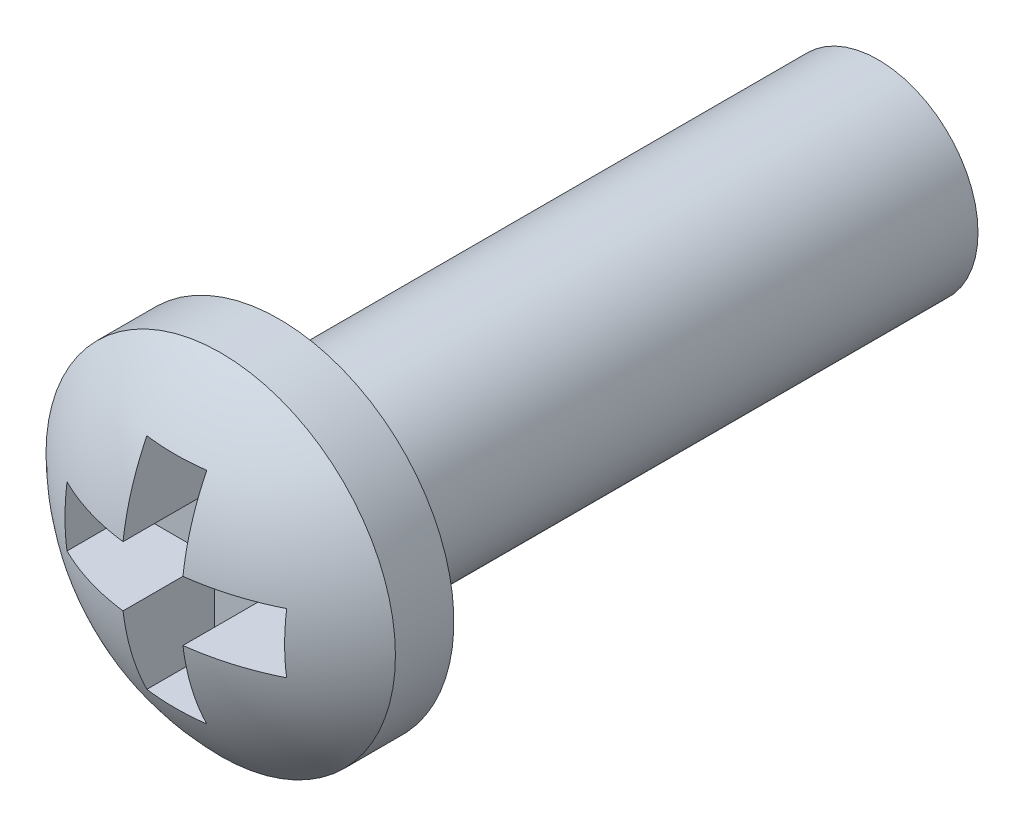
ISO-10303-21;
HEADER;
FILE_DESCRIPTION(('STEP AP214'),'2;1');
FILE_NAME('part.step','',(''),(''),'','','');
FILE_SCHEMA(('AUTOMOTIVE_DESIGN { 1 0 10303 214 1 1 1 1 }'));
ENDSEC;
DATA;
#1=APPLICATION_CONTEXT('core data for automotive mechanical design processes');
#2=APPLICATION_PROTOCOL_DEFINITION('international standard','automotive_design',2000,#1);
#3=PRODUCT_CONTEXT('',#1,'mechanical');
#4=PRODUCT('Part','Part','',(#3));
#5=PRODUCT_RELATED_PRODUCT_CATEGORY('part','',(#4));
#6=PRODUCT_DEFINITION_FORMATION('','',#4);
#7=PRODUCT_DEFINITION_CONTEXT('part definition',#1,'design');
#8=PRODUCT_DEFINITION('design','',#6,#7);
#9=PRODUCT_DEFINITION_SHAPE('','',#8);
#10=(LENGTH_UNIT() NAMED_UNIT(*) SI_UNIT(.MILLI.,.METRE.));
#11=(NAMED_UNIT(*) PLANE_ANGLE_UNIT() SI_UNIT($,.RADIAN.));
#12=(NAMED_UNIT(*) SI_UNIT($,.STERADIAN.) SOLID_ANGLE_UNIT());
#13=UNCERTAINTY_MEASURE_WITH_UNIT(LENGTH_MEASURE(1.E-05),#10,'distance_accuracy_value','');
#14=(GEOMETRIC_REPRESENTATION_CONTEXT(3) GLOBAL_UNCERTAINTY_ASSIGNED_CONTEXT((#13)) GLOBAL_UNIT_ASSIGNED_CONTEXT((#10,
#11,#12)) REPRESENTATION_CONTEXT('',''));
#15=CARTESIAN_POINT('',(0.,0.,0.));
#16=DIRECTION('',(0.,0.,1.));
#17=DIRECTION('',(1.,0.,0.));
#18=AXIS2_PLACEMENT_3D('',#15,#16,#17);
#19=CARTESIAN_POINT('',(0.,0.,-6.));
#20=DIRECTION('',(0.,0.,1.));
#21=DIRECTION('',(1.,0.,0.));
#22=AXIS2_PLACEMENT_3D('',#19,#20,#21);
#23=CYLINDRICAL_SURFACE('',#22,1.);
#24=CARTESIAN_POINT('',(0.,0.,-6.));
#25=DIRECTION('',(0.,0.,1.));
#26=DIRECTION('',(1.,0.,0.));
#27=AXIS2_PLACEMENT_3D('',#24,#25,#26);
#28=CIRCLE('',#27,1.);
#29=CARTESIAN_POINT('',(1.,0.,-6.));
#30=VERTEX_POINT('',#29);
#31=EDGE_CURVE('E212',#30,#30,#28,.T.);
#32=ORIENTED_EDGE('',*,*,#31,.T.);
#33=EDGE_LOOP('',(#32));
#34=FACE_BOUND('',#33,.T.);
#35=CARTESIAN_POINT('',(0.,0.,0.));
#36=DIRECTION('',(0.,0.,1.));
#37=DIRECTION('',(1.,0.,0.));
#38=AXIS2_PLACEMENT_3D('',#35,#36,#37);
#39=CIRCLE('',#38,1.);
#40=CARTESIAN_POINT('',(1.,0.,0.));
#41=VERTEX_POINT('',#40);
#42=EDGE_CURVE('E208',#41,#41,#39,.T.);
#43=ORIENTED_EDGE('',*,*,#42,.F.);
#44=EDGE_LOOP('',(#43));
#45=FACE_BOUND('',#44,.T.);
#46=ADVANCED_FACE('F41',(#34,#45),#23,.T.);
#47=CARTESIAN_POINT('',(0.,0.,-6.));
#48=DIRECTION('',(0.,0.,1.));
#49=DIRECTION('',(1.,0.,0.));
#50=AXIS2_PLACEMENT_3D('',#47,#48,#49);
#51=PLANE('',#50);
#52=ORIENTED_EDGE('',*,*,#31,.F.);
#53=EDGE_LOOP('',(#52));
#54=FACE_BOUND('',#53,.T.);
#55=ADVANCED_FACE('F281',(#54),#51,.F.);
#56=CARTESIAN_POINT('',(0.,0.,0.));
#57=DIRECTION('',(0.,0.,1.));
#58=DIRECTION('',(1.,0.,0.));
#59=AXIS2_PLACEMENT_3D('',#56,#57,#58);
#60=PLANE('',#59);
#61=ORIENTED_EDGE('',*,*,#42,.T.);
#62=EDGE_LOOP('',(#61));
#63=FACE_BOUND('',#62,.T.);
#64=CARTESIAN_POINT('',(0.,0.,0.));
#65=DIRECTION('',(0.,0.,-1.));
#66=DIRECTION('',(-1.,0.,0.));
#67=AXIS2_PLACEMENT_3D('',#64,#65,#66);
#68=CIRCLE('',#67,1.75);
#69=CARTESIAN_POINT('',(-1.75,0.,0.));
#70=VERTEX_POINT('',#69);
#71=EDGE_CURVE('E210',#70,#70,#68,.T.);
#72=ORIENTED_EDGE('',*,*,#71,.T.);
#73=EDGE_LOOP('',(#72));
#74=FACE_BOUND('',#73,.T.);
#75=ADVANCED_FACE('F286',(#63,#74),#60,.F.);
#76=CARTESIAN_POINT('',(0.,0.,-2.));
#77=DIRECTION('',(0.,0.,-1.));
#78=DIRECTION('',(-1.,0.,0.));
#79=AXIS2_PLACEMENT_3D('',#76,#77,#78);
#80=CYLINDRICAL_SURFACE('',#79,1.75);
#81=ORIENTED_EDGE('',*,*,#71,.F.);
#82=EDGE_LOOP('',(#81));
#83=FACE_BOUND('',#82,.T.);
#84=CARTESIAN_POINT('',(0.,0.,0.585357107135713));
#85=DIRECTION('',(0.,0.,-1.));
#86=DIRECTION('',(-1.,0.,0.));
#87=AXIS2_PLACEMENT_3D('',#84,#85,#86);
#88=CIRCLE('',#87,1.75);
#89=CARTESIAN_POINT('',(-1.75,0.,0.585357107135713));
#90=VERTEX_POINT('',#89);
#91=EDGE_CURVE('E179',#90,#90,#88,.T.);
#92=ORIENTED_EDGE('',*,*,#91,.T.);
#93=EDGE_LOOP('',(#92));
#94=FACE_BOUND('',#93,.T.);
#95=ADVANCED_FACE('F300',(#83,#94),#80,.T.);
#96=CARTESIAN_POINT('',(0.,0.,-1.2));
#97=DIRECTION('',(0.,0.,-1.));
#98=DIRECTION('',(1.,0.,0.));
#99=AXIS2_PLACEMENT_3D('',#96,#97,#98);
#100=SPHERICAL_SURFACE('',#99,2.5);
#101=CARTESIAN_POINT('',(0.,-1.1,-1.2));
#102=DIRECTION('',(0.,-1.,0.));
#103=DIRECTION('',(0.,0.,-1.));
#104=AXIS2_PLACEMENT_3D('',#101,#102,#103);
#105=CIRCLE('',#104,2.24499443206437);
#106=CARTESIAN_POINT('',(0.3,-1.1,1.0248595461287));
#107=VERTEX_POINT('',#106);
#108=CARTESIAN_POINT('',(-0.3,-1.1,1.0248595461287));
#109=VERTEX_POINT('',#108);
#110=EDGE_CURVE('E211',#107,#109,#105,.T.);
#111=ORIENTED_EDGE('',*,*,#110,.T.);
#112=CARTESIAN_POINT('',(-0.3,0.,-1.2));
#113=DIRECTION('',(-1.,0.,0.));
#114=DIRECTION('',(0.,0.,1.));
#115=AXIS2_PLACEMENT_3D('',#112,#113,#114);
#116=CIRCLE('',#115,2.48193472919818);
#117=CARTESIAN_POINT('',(-0.3,-0.3,1.26373699895098));
#118=VERTEX_POINT('',#117);
#119=EDGE_CURVE('E11',#109,#118,#116,.T.);
#120=ORIENTED_EDGE('',*,*,#119,.T.);
#121=CARTESIAN_POINT('',(0.,-0.3,-1.2));
#122=DIRECTION('',(0.,-1.,0.));
#123=DIRECTION('',(0.,0.,-1.));
#124=AXIS2_PLACEMENT_3D('',#121,#122,#123);
#125=CIRCLE('',#124,2.48193472919818);
#126=CARTESIAN_POINT('',(-1.1,-0.3,1.0248595461287));
#127=VERTEX_POINT('',#126);
#128=EDGE_CURVE('E48',#118,#127,#125,.T.);
#129=ORIENTED_EDGE('',*,*,#128,.T.);
#130=CARTESIAN_POINT('',(-1.1,0.,-1.2));
#131=DIRECTION('',(-1.,0.,0.));
#132=DIRECTION('',(0.,0.,1.));
#133=AXIS2_PLACEMENT_3D('',#130,#131,#132);
#134=CIRCLE('',#133,2.24499443206437);
#135=CARTESIAN_POINT('',(-1.1,0.3,1.0248595461287));
#136=VERTEX_POINT('',#135);
#137=EDGE_CURVE('E241',#127,#136,#134,.T.);
#138=ORIENTED_EDGE('',*,*,#137,.T.);
#139=CARTESIAN_POINT('',(0.,0.3,-1.2));
#140=DIRECTION('',(0.,1.,0.));
#141=DIRECTION('',(0.,0.,1.));
#142=AXIS2_PLACEMENT_3D('',#139,#140,#141);
#143=CIRCLE('',#142,2.48193472919818);
#144=CARTESIAN_POINT('',(-0.3,0.3,1.26373699895098));
#145=VERTEX_POINT('',#144);
#146=EDGE_CURVE('E236',#136,#145,#143,.T.);
#147=ORIENTED_EDGE('',*,*,#146,.T.);
#148=CARTESIAN_POINT('',(-0.3,0.,-1.2));
#149=DIRECTION('',(-1.,0.,0.));
#150=DIRECTION('',(0.,0.,1.));
#151=AXIS2_PLACEMENT_3D('',#148,#149,#150);
#152=CIRCLE('',#151,2.48193472919818);
#153=CARTESIAN_POINT('',(-0.3,1.1,1.0248595461287));
#154=VERTEX_POINT('',#153);
#155=EDGE_CURVE('E237',#145,#154,#152,.T.);
#156=ORIENTED_EDGE('',*,*,#155,.T.);
#157=CARTESIAN_POINT('',(0.,1.1,-1.2));
#158=DIRECTION('',(0.,1.,0.));
#159=DIRECTION('',(0.,0.,1.));
#160=AXIS2_PLACEMENT_3D('',#157,#158,#159);
#161=CIRCLE('',#160,2.24499443206437);
#162=CARTESIAN_POINT('',(0.3,1.1,1.0248595461287));
#163=VERTEX_POINT('',#162);
#164=EDGE_CURVE('E231',#154,#163,#161,.T.);
#165=ORIENTED_EDGE('',*,*,#164,.T.);
#166=CARTESIAN_POINT('',(0.3,0.,-1.2));
#167=DIRECTION('',(1.,0.,0.));
#168=DIRECTION('',(0.,0.,-1.));
#169=AXIS2_PLACEMENT_3D('',#166,#167,#168);
#170=CIRCLE('',#169,2.48193472919818);
#171=CARTESIAN_POINT('',(0.3,0.3,1.26373699895098));
#172=VERTEX_POINT('',#171);
#173=EDGE_CURVE('E228',#163,#172,#170,.T.);
#174=ORIENTED_EDGE('',*,*,#173,.T.);
#175=CARTESIAN_POINT('',(0.,0.3,-1.2));
#176=DIRECTION('',(0.,1.,0.));
#177=DIRECTION('',(0.,0.,1.));
#178=AXIS2_PLACEMENT_3D('',#175,#176,#177);
#179=CIRCLE('',#178,2.48193472919818);
#180=CARTESIAN_POINT('',(1.1,0.3,1.0248595461287));
#181=VERTEX_POINT('',#180);
#182=EDGE_CURVE('E229',#172,#181,#179,.T.);
#183=ORIENTED_EDGE('',*,*,#182,.T.);
#184=CARTESIAN_POINT('',(1.1,0.,-1.2));
#185=DIRECTION('',(1.,0.,0.));
#186=DIRECTION('',(0.,0.,-1.));
#187=AXIS2_PLACEMENT_3D('',#184,#185,#186);
#188=CIRCLE('',#187,2.24499443206437);
#189=CARTESIAN_POINT('',(1.1,-0.3,1.0248595461287));
#190=VERTEX_POINT('',#189);
#191=EDGE_CURVE('E224',#181,#190,#188,.T.);
#192=ORIENTED_EDGE('',*,*,#191,.T.);
#193=CARTESIAN_POINT('',(0.,-0.3,-1.2));
#194=DIRECTION('',(0.,-1.,0.));
#195=DIRECTION('',(0.,0.,-1.));
#196=AXIS2_PLACEMENT_3D('',#193,#194,#195);
#197=CIRCLE('',#196,2.48193472919818);
#198=CARTESIAN_POINT('',(0.3,-0.3,1.26373699895098));
#199=VERTEX_POINT('',#198);
#200=EDGE_CURVE('E222',#190,#199,#197,.T.);
#201=ORIENTED_EDGE('',*,*,#200,.T.);
#202=CARTESIAN_POINT('',(0.3,0.,-1.2));
#203=DIRECTION('',(1.,0.,0.));
#204=DIRECTION('',(0.,0.,-1.));
#205=AXIS2_PLACEMENT_3D('',#202,#203,#204);
#206=CIRCLE('',#205,2.48193472919818);
#207=EDGE_CURVE('E220',#199,#107,#206,.T.);
#208=ORIENTED_EDGE('',*,*,#207,.T.);
#209=EDGE_LOOP('',(#111,#120,#129,#138,#147,#156,#165,#174,#183,#192,#201,#208));
#210=FACE_BOUND('',#209,.T.);
#211=ORIENTED_EDGE('',*,*,#91,.F.);
#212=EDGE_LOOP('',(#211));
#213=FACE_BOUND('',#212,.T.);
#214=ADVANCED_FACE('F242',(#210,#213),#100,.T.);
#215=CARTESIAN_POINT('',(-0.3,-0.3,0.35));
#216=DIRECTION('',(-1.,0.,0.));
#217=DIRECTION('',(0.,0.,1.));
#218=AXIS2_PLACEMENT_3D('',#215,#216,#217);
#219=PLANE('',#218);
#220=DIRECTION('',(0.,0.,1.));
#221=VECTOR('',#220,1.);
#222=CARTESIAN_POINT('',(-0.3,-1.1,0.35));
#223=LINE('',#222,#221);
#224=CARTESIAN_POINT('',(-0.3,-1.1,0.35));
#225=VERTEX_POINT('',#224);
#226=EDGE_CURVE('E54',#225,#109,#223,.T.);
#227=ORIENTED_EDGE('',*,*,#226,.F.);
#228=DIRECTION('',(0.,-1.,0.));
#229=VECTOR('',#228,1.);
#230=CARTESIAN_POINT('',(-0.3,-0.3,0.35));
#231=LINE('',#230,#229);
#232=CARTESIAN_POINT('',(-0.3,-0.3,0.35));
#233=VERTEX_POINT('',#232);
#234=EDGE_CURVE('E129',#233,#225,#231,.T.);
#235=ORIENTED_EDGE('',*,*,#234,.F.);
#236=DIRECTION('',(0.,0.,1.));
#237=VECTOR('',#236,1.);
#238=CARTESIAN_POINT('',(-0.3,-0.3,0.35));
#239=LINE('',#238,#237);
#240=EDGE_CURVE('E171',#233,#118,#239,.T.);
#241=ORIENTED_EDGE('',*,*,#240,.T.);
#242=ORIENTED_EDGE('',*,*,#119,.F.);
#243=EDGE_LOOP('',(#227,#235,#241,#242));
#244=FACE_BOUND('',#243,.T.);
#245=ADVANCED_FACE('F127',(#244),#219,.F.);
#246=CARTESIAN_POINT('',(-1.1,-0.3,0.35));
#247=DIRECTION('',(0.,-1.,0.));
#248=DIRECTION('',(0.,0.,-1.));
#249=AXIS2_PLACEMENT_3D('',#246,#247,#248);
#250=PLANE('',#249);
#251=ORIENTED_EDGE('',*,*,#240,.F.);
#252=DIRECTION('',(1.,0.,0.));
#253=VECTOR('',#252,1.);
#254=CARTESIAN_POINT('',(-1.1,-0.3,0.35));
#255=LINE('',#254,#253);
#256=CARTESIAN_POINT('',(-1.1,-0.3,0.35));
#257=VERTEX_POINT('',#256);
#258=EDGE_CURVE('E131',#257,#233,#255,.T.);
#259=ORIENTED_EDGE('',*,*,#258,.F.);
#260=DIRECTION('',(0.,0.,1.));
#261=VECTOR('',#260,1.);
#262=CARTESIAN_POINT('',(-1.1,-0.3,0.35));
#263=LINE('',#262,#261);
#264=EDGE_CURVE('E180',#257,#127,#263,.T.);
#265=ORIENTED_EDGE('',*,*,#264,.T.);
#266=ORIENTED_EDGE('',*,*,#128,.F.);
#267=EDGE_LOOP('',(#251,#259,#265,#266));
#268=FACE_BOUND('',#267,.T.);
#269=ADVANCED_FACE('F273',(#268),#250,.F.);
#270=CARTESIAN_POINT('',(-1.1,0.3,0.35));
#271=DIRECTION('',(-1.,0.,0.));
#272=DIRECTION('',(0.,0.,1.));
#273=AXIS2_PLACEMENT_3D('',#270,#271,#272);
#274=PLANE('',#273);
#275=ORIENTED_EDGE('',*,*,#264,.F.);
#276=DIRECTION('',(0.,-1.,0.));
#277=VECTOR('',#276,1.);
#278=CARTESIAN_POINT('',(-1.1,0.3,0.35));
#279=LINE('',#278,#277);
#280=CARTESIAN_POINT('',(-1.1,0.3,0.35));
#281=VERTEX_POINT('',#280);
#282=EDGE_CURVE('E175',#281,#257,#279,.T.);
#283=ORIENTED_EDGE('',*,*,#282,.F.);
#284=DIRECTION('',(0.,0.,1.));
#285=VECTOR('',#284,1.);
#286=CARTESIAN_POINT('',(-1.1,0.3,0.35));
#287=LINE('',#286,#285);
#288=EDGE_CURVE('E178',#281,#136,#287,.T.);
#289=ORIENTED_EDGE('',*,*,#288,.T.);
#290=ORIENTED_EDGE('',*,*,#137,.F.);
#291=EDGE_LOOP('',(#275,#283,#289,#290));
#292=FACE_BOUND('',#291,.T.);
#293=ADVANCED_FACE('F275',(#292),#274,.F.);
#294=CARTESIAN_POINT('',(-0.3,0.3,0.35));
#295=DIRECTION('',(0.,1.,0.));
#296=DIRECTION('',(0.,0.,1.));
#297=AXIS2_PLACEMENT_3D('',#294,#295,#296);
#298=PLANE('',#297);
#299=ORIENTED_EDGE('',*,*,#288,.F.);
#300=DIRECTION('',(-1.,0.,0.));
#301=VECTOR('',#300,1.);
#302=CARTESIAN_POINT('',(-0.3,0.3,0.35));
#303=LINE('',#302,#301);
#304=CARTESIAN_POINT('',(-0.3,0.3,0.35));
#305=VERTEX_POINT('',#304);
#306=EDGE_CURVE('E168',#305,#281,#303,.T.);
#307=ORIENTED_EDGE('',*,*,#306,.F.);
#308=DIRECTION('',(0.,0.,1.));
#309=VECTOR('',#308,1.);
#310=CARTESIAN_POINT('',(-0.3,0.3,0.35));
#311=LINE('',#310,#309);
#312=EDGE_CURVE('E181',#305,#145,#311,.T.);
#313=ORIENTED_EDGE('',*,*,#312,.T.);
#314=ORIENTED_EDGE('',*,*,#146,.F.);
#315=EDGE_LOOP('',(#299,#307,#313,#314));
#316=FACE_BOUND('',#315,.T.);
#317=ADVANCED_FACE('F269',(#316),#298,.F.);
#318=CARTESIAN_POINT('',(-0.3,1.1,0.35));
#319=DIRECTION('',(-1.,0.,0.));
#320=DIRECTION('',(0.,0.,1.));
#321=AXIS2_PLACEMENT_3D('',#318,#319,#320);
#322=PLANE('',#321);
#323=ORIENTED_EDGE('',*,*,#312,.F.);
#324=DIRECTION('',(0.,-1.,0.));
#325=VECTOR('',#324,1.);
#326=CARTESIAN_POINT('',(-0.3,1.1,0.35));
#327=LINE('',#326,#325);
#328=CARTESIAN_POINT('',(-0.3,1.1,0.35));
#329=VERTEX_POINT('',#328);
#330=EDGE_CURVE('E169',#329,#305,#327,.T.);
#331=ORIENTED_EDGE('',*,*,#330,.F.);
#332=DIRECTION('',(0.,0.,1.));
#333=VECTOR('',#332,1.);
#334=CARTESIAN_POINT('',(-0.3,1.1,0.35));
#335=LINE('',#334,#333);
#336=EDGE_CURVE('E188',#329,#154,#335,.T.);
#337=ORIENTED_EDGE('',*,*,#336,.T.);
#338=ORIENTED_EDGE('',*,*,#155,.F.);
#339=EDGE_LOOP('',(#323,#331,#337,#338));
#340=FACE_BOUND('',#339,.T.);
#341=ADVANCED_FACE('F266',(#340),#322,.F.);
#342=CARTESIAN_POINT('',(0.3,1.1,0.35));
#343=DIRECTION('',(0.,1.,0.));
#344=DIRECTION('',(0.,0.,1.));
#345=AXIS2_PLACEMENT_3D('',#342,#343,#344);
#346=PLANE('',#345);
#347=ORIENTED_EDGE('',*,*,#336,.F.);
#348=DIRECTION('',(-1.,0.,0.));
#349=VECTOR('',#348,1.);
#350=CARTESIAN_POINT('',(0.3,1.1,0.35));
#351=LINE('',#350,#349);
#352=CARTESIAN_POINT('',(0.3,1.1,0.35));
#353=VERTEX_POINT('',#352);
#354=EDGE_CURVE('E164',#353,#329,#351,.T.);
#355=ORIENTED_EDGE('',*,*,#354,.F.);
#356=DIRECTION('',(0.,0.,1.));
#357=VECTOR('',#356,1.);
#358=CARTESIAN_POINT('',(0.3,1.1,0.35));
#359=LINE('',#358,#357);
#360=EDGE_CURVE('E189',#353,#163,#359,.T.);
#361=ORIENTED_EDGE('',*,*,#360,.T.);
#362=ORIENTED_EDGE('',*,*,#164,.F.);
#363=EDGE_LOOP('',(#347,#355,#361,#362));
#364=FACE_BOUND('',#363,.T.);
#365=ADVANCED_FACE('F261',(#364),#346,.F.);
#366=CARTESIAN_POINT('',(0.3,0.3,0.35));
#367=DIRECTION('',(1.,0.,0.));
#368=DIRECTION('',(0.,0.,-1.));
#369=AXIS2_PLACEMENT_3D('',#366,#367,#368);
#370=PLANE('',#369);
#371=ORIENTED_EDGE('',*,*,#360,.F.);
#372=DIRECTION('',(0.,1.,0.));
#373=VECTOR('',#372,1.);
#374=CARTESIAN_POINT('',(0.3,0.3,0.35));
#375=LINE('',#374,#373);
#376=CARTESIAN_POINT('',(0.3,0.3,0.35));
#377=VERTEX_POINT('',#376);
#378=EDGE_CURVE('E158',#377,#353,#375,.T.);
#379=ORIENTED_EDGE('',*,*,#378,.F.);
#380=DIRECTION('',(0.,0.,1.));
#381=VECTOR('',#380,1.);
#382=CARTESIAN_POINT('',(0.3,0.3,0.35));
#383=LINE('',#382,#381);
#384=EDGE_CURVE('E195',#377,#172,#383,.T.);
#385=ORIENTED_EDGE('',*,*,#384,.T.);
#386=ORIENTED_EDGE('',*,*,#173,.F.);
#387=EDGE_LOOP('',(#371,#379,#385,#386));
#388=FACE_BOUND('',#387,.T.);
#389=ADVANCED_FACE('F263',(#388),#370,.F.);
#390=CARTESIAN_POINT('',(1.1,0.3,0.35));
#391=DIRECTION('',(0.,1.,0.));
#392=DIRECTION('',(0.,0.,1.));
#393=AXIS2_PLACEMENT_3D('',#390,#391,#392);
#394=PLANE('',#393);
#395=ORIENTED_EDGE('',*,*,#384,.F.);
#396=DIRECTION('',(-1.,0.,0.));
#397=VECTOR('',#396,1.);
#398=CARTESIAN_POINT('',(1.1,0.3,0.35));
#399=LINE('',#398,#397);
#400=CARTESIAN_POINT('',(1.1,0.3,0.35));
#401=VERTEX_POINT('',#400);
#402=EDGE_CURVE('E160',#401,#377,#399,.T.);
#403=ORIENTED_EDGE('',*,*,#402,.F.);
#404=DIRECTION('',(0.,0.,1.));
#405=VECTOR('',#404,1.);
#406=CARTESIAN_POINT('',(1.1,0.3,0.35));
#407=LINE('',#406,#405);
#408=EDGE_CURVE('E194',#401,#181,#407,.T.);
#409=ORIENTED_EDGE('',*,*,#408,.T.);
#410=ORIENTED_EDGE('',*,*,#182,.F.);
#411=EDGE_LOOP('',(#395,#403,#409,#410));
#412=FACE_BOUND('',#411,.T.);
#413=ADVANCED_FACE('F257',(#412),#394,.F.);
#414=CARTESIAN_POINT('',(1.1,-0.3,0.35));
#415=DIRECTION('',(1.,0.,0.));
#416=DIRECTION('',(0.,0.,-1.));
#417=AXIS2_PLACEMENT_3D('',#414,#415,#416);
#418=PLANE('',#417);
#419=ORIENTED_EDGE('',*,*,#408,.F.);
#420=DIRECTION('',(0.,1.,0.));
#421=VECTOR('',#420,1.);
#422=CARTESIAN_POINT('',(1.1,-0.3,0.35));
#423=LINE('',#422,#421);
#424=CARTESIAN_POINT('',(1.1,-0.3,0.35));
#425=VERTEX_POINT('',#424);
#426=EDGE_CURVE('E151',#425,#401,#423,.T.);
#427=ORIENTED_EDGE('',*,*,#426,.F.);
#428=DIRECTION('',(0.,0.,1.));
#429=VECTOR('',#428,1.);
#430=CARTESIAN_POINT('',(1.1,-0.3,0.35));
#431=LINE('',#430,#429);
#432=EDGE_CURVE('E198',#425,#190,#431,.T.);
#433=ORIENTED_EDGE('',*,*,#432,.T.);
#434=ORIENTED_EDGE('',*,*,#191,.F.);
#435=EDGE_LOOP('',(#419,#427,#433,#434));
#436=FACE_BOUND('',#435,.T.);
#437=ADVANCED_FACE('F251',(#436),#418,.F.);
#438=CARTESIAN_POINT('',(0.3,-0.3,0.35));
#439=DIRECTION('',(0.,-1.,0.));
#440=DIRECTION('',(0.,0.,-1.));
#441=AXIS2_PLACEMENT_3D('',#438,#439,#440);
#442=PLANE('',#441);
#443=ORIENTED_EDGE('',*,*,#432,.F.);
#444=DIRECTION('',(1.,0.,0.));
#445=VECTOR('',#444,1.);
#446=CARTESIAN_POINT('',(0.3,-0.3,0.35));
#447=LINE('',#446,#445);
#448=CARTESIAN_POINT('',(0.3,-0.3,0.35));
#449=VERTEX_POINT('',#448);
#450=EDGE_CURVE('E152',#449,#425,#447,.T.);
#451=ORIENTED_EDGE('',*,*,#450,.F.);
#452=DIRECTION('',(0.,0.,1.));
#453=VECTOR('',#452,1.);
#454=CARTESIAN_POINT('',(0.3,-0.3,0.35));
#455=LINE('',#454,#453);
#456=EDGE_CURVE('E201',#449,#199,#455,.T.);
#457=ORIENTED_EDGE('',*,*,#456,.T.);
#458=ORIENTED_EDGE('',*,*,#200,.F.);
#459=EDGE_LOOP('',(#443,#451,#457,#458));
#460=FACE_BOUND('',#459,.T.);
#461=ADVANCED_FACE('F254',(#460),#442,.F.);
#462=CARTESIAN_POINT('',(0.3,-1.1,0.35));
#463=DIRECTION('',(1.,0.,0.));
#464=DIRECTION('',(0.,0.,-1.));
#465=AXIS2_PLACEMENT_3D('',#462,#463,#464);
#466=PLANE('',#465);
#467=ORIENTED_EDGE('',*,*,#456,.F.);
#468=DIRECTION('',(0.,1.,0.));
#469=VECTOR('',#468,1.);
#470=CARTESIAN_POINT('',(0.3,-1.1,0.35));
#471=LINE('',#470,#469);
#472=CARTESIAN_POINT('',(0.3,-1.1,0.35));
#473=VERTEX_POINT('',#472);
#474=EDGE_CURVE('E145',#473,#449,#471,.T.);
#475=ORIENTED_EDGE('',*,*,#474,.F.);
#476=DIRECTION('',(0.,0.,1.));
#477=VECTOR('',#476,1.);
#478=CARTESIAN_POINT('',(0.3,-1.1,0.35));
#479=LINE('',#478,#477);
#480=EDGE_CURVE('E134',#473,#107,#479,.T.);
#481=ORIENTED_EDGE('',*,*,#480,.T.);
#482=ORIENTED_EDGE('',*,*,#207,.F.);
#483=EDGE_LOOP('',(#467,#475,#481,#482));
#484=FACE_BOUND('',#483,.T.);
#485=ADVANCED_FACE('F248',(#484),#466,.F.);
#486=CARTESIAN_POINT('',(-0.3,-1.1,0.35));
#487=DIRECTION('',(0.,-1.,0.));
#488=DIRECTION('',(0.,0.,-1.));
#489=AXIS2_PLACEMENT_3D('',#486,#487,#488);
#490=PLANE('',#489);
#491=ORIENTED_EDGE('',*,*,#480,.F.);
#492=DIRECTION('',(1.,0.,0.));
#493=VECTOR('',#492,1.);
#494=CARTESIAN_POINT('',(-0.3,-1.1,0.35));
#495=LINE('',#494,#493);
#496=EDGE_CURVE('E140',#225,#473,#495,.T.);
#497=ORIENTED_EDGE('',*,*,#496,.F.);
#498=ORIENTED_EDGE('',*,*,#226,.T.);
#499=ORIENTED_EDGE('',*,*,#110,.F.);
#500=EDGE_LOOP('',(#491,#497,#498,#499));
#501=FACE_BOUND('',#500,.T.);
#502=ADVANCED_FACE('F139',(#501),#490,.F.);
#503=CARTESIAN_POINT('',(0.,0.,0.35));
#504=DIRECTION('',(0.,0.,1.));
#505=DIRECTION('',(1.,0.,0.));
#506=AXIS2_PLACEMENT_3D('',#503,#504,#505);
#507=PLANE('',#506);
#508=ORIENTED_EDGE('',*,*,#234,.T.);
#509=ORIENTED_EDGE('',*,*,#496,.T.);
#510=ORIENTED_EDGE('',*,*,#474,.T.);
#511=ORIENTED_EDGE('',*,*,#450,.T.);
#512=ORIENTED_EDGE('',*,*,#426,.T.);
#513=ORIENTED_EDGE('',*,*,#402,.T.);
#514=ORIENTED_EDGE('',*,*,#378,.T.);
#515=ORIENTED_EDGE('',*,*,#354,.T.);
#516=ORIENTED_EDGE('',*,*,#330,.T.);
#517=ORIENTED_EDGE('',*,*,#306,.T.);
#518=ORIENTED_EDGE('',*,*,#282,.T.);
#519=ORIENTED_EDGE('',*,*,#258,.T.);
#520=EDGE_LOOP('',(#508,#509,#510,#511,#512,#513,#514,#515,#516,#517,#518,#519));
#521=FACE_BOUND('',#520,.T.);
#522=ADVANCED_FACE('F142',(#521),#507,.T.);
#523=CLOSED_SHELL('',(#46,#55,#75,#95,#214,#245,#269,#293,#317,#341,#365,#389,#413,#437,#461,
#485,#502,#522));
#524=MANIFOLD_SOLID_BREP('B2',#523);
#525=ADVANCED_BREP_SHAPE_REPRESENTATION('',(#18,#524),#14);
#526=SHAPE_DEFINITION_REPRESENTATION(#9,#525);
ENDSEC;
END-ISO-10303-21;
